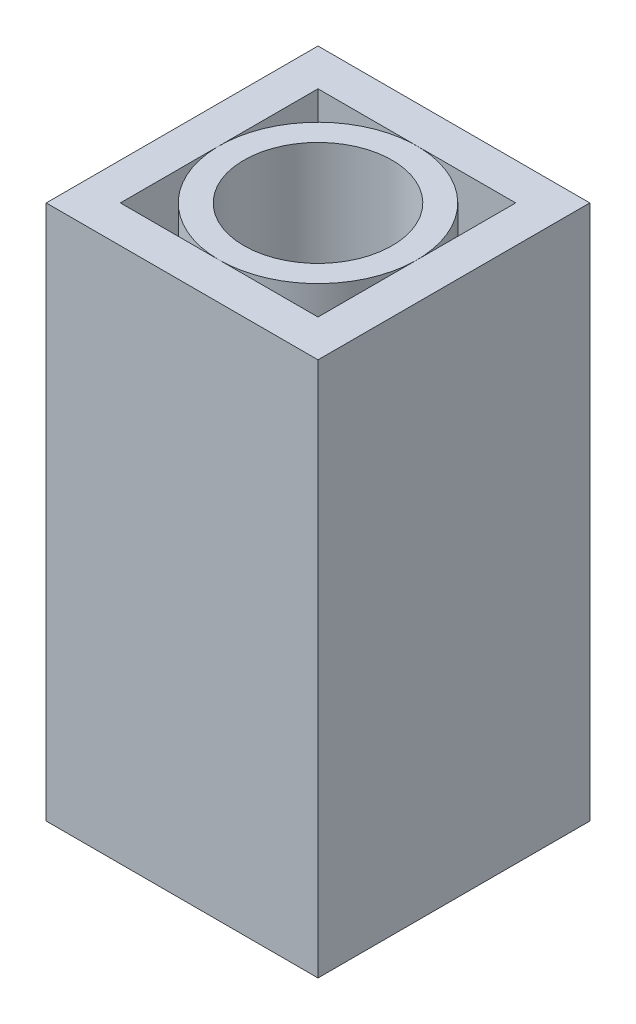
ISO-10303-21;
HEADER;
FILE_DESCRIPTION(('STEP AP214'),'2;1');
FILE_NAME('part.step','',(''),(''),'','','');
FILE_SCHEMA(('AUTOMOTIVE_DESIGN { 1 0 10303 214 1 1 1 1 }'));
ENDSEC;
DATA;
#1=APPLICATION_CONTEXT('core data for automotive mechanical design processes');
#2=APPLICATION_PROTOCOL_DEFINITION('international standard','automotive_design',2000,#1);
#3=PRODUCT_CONTEXT('',#1,'mechanical');
#4=PRODUCT('Part','Part','',(#3));
#5=PRODUCT_RELATED_PRODUCT_CATEGORY('part','',(#4));
#6=PRODUCT_DEFINITION_FORMATION('','',#4);
#7=PRODUCT_DEFINITION_CONTEXT('part definition',#1,'design');
#8=PRODUCT_DEFINITION('design','',#6,#7);
#9=PRODUCT_DEFINITION_SHAPE('','',#8);
#10=(LENGTH_UNIT() NAMED_UNIT(*) SI_UNIT(.MILLI.,.METRE.));
#11=(NAMED_UNIT(*) PLANE_ANGLE_UNIT() SI_UNIT($,.RADIAN.));
#12=(NAMED_UNIT(*) SI_UNIT($,.STERADIAN.) SOLID_ANGLE_UNIT());
#13=UNCERTAINTY_MEASURE_WITH_UNIT(LENGTH_MEASURE(1.E-05),#10,'distance_accuracy_value','');
#14=(GEOMETRIC_REPRESENTATION_CONTEXT(3) GLOBAL_UNCERTAINTY_ASSIGNED_CONTEXT((#13)) GLOBAL_UNIT_ASSIGNED_CONTEXT((#10,
#11,#12)) REPRESENTATION_CONTEXT('',''));
#15=CARTESIAN_POINT('',(0.,0.,0.));
#16=DIRECTION('',(0.,0.,1.));
#17=DIRECTION('',(1.,0.,0.));
#18=AXIS2_PLACEMENT_3D('',#15,#16,#17);
#19=CARTESIAN_POINT('',(0.,65.,0.));
#20=DIRECTION('',(0.,-1.,0.));
#21=DIRECTION('',(0.,0.,-1.));
#22=AXIS2_PLACEMENT_3D('',#19,#20,#21);
#23=CYLINDRICAL_SURFACE('',#22,9.);
#24=CARTESIAN_POINT('',(0.,30.,0.));
#25=DIRECTION('',(0.,1.,0.));
#26=DIRECTION('',(0.,0.,1.));
#27=AXIS2_PLACEMENT_3D('',#24,#25,#26);
#28=CIRCLE('',#27,9.);
#29=CARTESIAN_POINT('',(0.,30.,9.));
#30=VERTEX_POINT('',#29);
#31=EDGE_CURVE('E12',#30,#30,#28,.T.);
#32=ORIENTED_EDGE('',*,*,#31,.F.);
#33=EDGE_LOOP('',(#32));
#34=FACE_BOUND('',#33,.T.);
#35=CARTESIAN_POINT('',(0.,65.,0.));
#36=DIRECTION('',(0.,1.,0.));
#37=DIRECTION('',(0.,0.,1.));
#38=AXIS2_PLACEMENT_3D('',#35,#36,#37);
#39=CIRCLE('',#38,9.);
#40=CARTESIAN_POINT('',(0.,65.,9.));
#41=VERTEX_POINT('',#40);
#42=EDGE_CURVE('E70',#41,#41,#39,.T.);
#43=ORIENTED_EDGE('',*,*,#42,.T.);
#44=EDGE_LOOP('',(#43));
#45=FACE_BOUND('',#44,.T.);
#46=ADVANCED_FACE('F60',(#34,#45),#23,.F.);
#47=CARTESIAN_POINT('',(0.,65.,0.));
#48=DIRECTION('',(0.,-1.,0.));
#49=DIRECTION('',(0.,0.,-1.));
#50=AXIS2_PLACEMENT_3D('',#47,#48,#49);
#51=CYLINDRICAL_SURFACE('',#50,12.);
#52=CARTESIAN_POINT('',(0.,65.,0.));
#53=DIRECTION('',(0.,1.,0.));
#54=DIRECTION('',(0.,0.,1.));
#55=AXIS2_PLACEMENT_3D('',#52,#53,#54);
#56=CIRCLE('',#55,12.);
#57=CARTESIAN_POINT('',(0.,65.,12.));
#58=VERTEX_POINT('',#57);
#59=EDGE_CURVE('E66',#58,#58,#56,.T.);
#60=ORIENTED_EDGE('',*,*,#59,.F.);
#61=EDGE_LOOP('',(#60));
#62=FACE_BOUND('',#61,.T.);
#63=CARTESIAN_POINT('',(0.,0.,0.));
#64=DIRECTION('',(0.,1.,0.));
#65=DIRECTION('',(0.,0.,1.));
#66=AXIS2_PLACEMENT_3D('',#63,#64,#65);
#67=CIRCLE('',#66,12.);
#68=CARTESIAN_POINT('',(0.,0.,12.));
#69=VERTEX_POINT('',#68);
#70=EDGE_CURVE('E75',#69,#69,#67,.T.);
#71=ORIENTED_EDGE('',*,*,#70,.T.);
#72=EDGE_LOOP('',(#71));
#73=FACE_BOUND('',#72,.T.);
#74=ADVANCED_FACE('F80',(#62,#73),#51,.T.);
#75=CARTESIAN_POINT('',(0.,65.,0.));
#76=DIRECTION('',(0.,1.,0.));
#77=DIRECTION('',(0.,0.,1.));
#78=AXIS2_PLACEMENT_3D('',#75,#76,#77);
#79=PLANE('',#78);
#80=ORIENTED_EDGE('',*,*,#42,.F.);
#81=EDGE_LOOP('',(#80));
#82=FACE_BOUND('',#81,.T.);
#83=ORIENTED_EDGE('',*,*,#59,.T.);
#84=EDGE_LOOP('',(#83));
#85=FACE_BOUND('',#84,.T.);
#86=ADVANCED_FACE('F85',(#82,#85),#79,.T.);
#87=CARTESIAN_POINT('',(0.,0.,0.));
#88=DIRECTION('',(0.,1.,0.));
#89=DIRECTION('',(0.,0.,1.));
#90=AXIS2_PLACEMENT_3D('',#87,#88,#89);
#91=PLANE('',#90);
#92=ORIENTED_EDGE('',*,*,#70,.F.);
#93=EDGE_LOOP('',(#92));
#94=FACE_BOUND('',#93,.T.);
#95=ADVANCED_FACE('F82',(#94),#91,.F.);
#96=CARTESIAN_POINT('',(0.,30.,0.));
#97=DIRECTION('',(0.,1.,0.));
#98=DIRECTION('',(0.,0.,1.));
#99=AXIS2_PLACEMENT_3D('',#96,#97,#98);
#100=PLANE('',#99);
#101=ORIENTED_EDGE('',*,*,#31,.T.);
#102=EDGE_LOOP('',(#101));
#103=FACE_BOUND('',#102,.T.);
#104=ADVANCED_FACE('F84',(#103),#100,.T.);
#105=CLOSED_SHELL('',(#46,#74,#86,#95,#104));
#106=MANIFOLD_SOLID_BREP('B2',#105);
#107=CARTESIAN_POINT('',(0.,65.,16.5));
#108=DIRECTION('',(0.,0.,-1.));
#109=DIRECTION('',(-1.,0.,0.));
#110=AXIS2_PLACEMENT_3D('',#107,#108,#109);
#111=PLANE('',#110);
#112=DIRECTION('',(1.,0.,0.));
#113=VECTOR('',#112,1.);
#114=CARTESIAN_POINT('',(0.,0.,16.5));
#115=LINE('',#114,#113);
#116=CARTESIAN_POINT('',(-16.4999999998139,0.,16.5));
#117=VERTEX_POINT('',#116);
#118=CARTESIAN_POINT('',(16.4999999998139,0.,16.5));
#119=VERTEX_POINT('',#118);
#120=EDGE_CURVE('E242',#117,#119,#115,.T.);
#121=ORIENTED_EDGE('',*,*,#120,.T.);
#122=DIRECTION('',(0.,-1.,0.));
#123=VECTOR('',#122,1.);
#124=CARTESIAN_POINT('',(16.4999999998139,65.,16.5));
#125=LINE('',#124,#123);
#126=CARTESIAN_POINT('',(16.4999999998139,65.,16.5));
#127=VERTEX_POINT('',#126);
#128=EDGE_CURVE('E58',#127,#119,#125,.T.);
#129=ORIENTED_EDGE('',*,*,#128,.F.);
#130=DIRECTION('',(1.,0.,0.));
#131=VECTOR('',#130,1.);
#132=CARTESIAN_POINT('',(0.,65.,16.5));
#133=LINE('',#132,#131);
#134=CARTESIAN_POINT('',(-16.4999999998139,65.,16.5));
#135=VERTEX_POINT('',#134);
#136=EDGE_CURVE('E213',#135,#127,#133,.T.);
#137=ORIENTED_EDGE('',*,*,#136,.F.);
#138=DIRECTION('',(0.,-1.,0.));
#139=VECTOR('',#138,1.);
#140=CARTESIAN_POINT('',(-16.4999999998139,65.,16.5));
#141=LINE('',#140,#139);
#142=EDGE_CURVE('E153',#135,#117,#141,.T.);
#143=ORIENTED_EDGE('',*,*,#142,.T.);
#144=EDGE_LOOP('',(#121,#129,#137,#143));
#145=FACE_BOUND('',#144,.T.);
#146=ADVANCED_FACE('F134',(#145),#111,.F.);
#147=CARTESIAN_POINT('',(16.4999999998139,65.,0.));
#148=DIRECTION('',(-1.,0.,0.));
#149=DIRECTION('',(0.,0.,1.));
#150=AXIS2_PLACEMENT_3D('',#147,#148,#149);
#151=PLANE('',#150);
#152=DIRECTION('',(0.,0.,-1.));
#153=VECTOR('',#152,1.);
#154=CARTESIAN_POINT('',(16.4999999998139,0.,0.));
#155=LINE('',#154,#153);
#156=CARTESIAN_POINT('',(16.4999999998139,0.,-16.5));
#157=VERTEX_POINT('',#156);
#158=EDGE_CURVE('E219',#119,#157,#155,.T.);
#159=ORIENTED_EDGE('',*,*,#158,.T.);
#160=DIRECTION('',(0.,-1.,0.));
#161=VECTOR('',#160,1.);
#162=CARTESIAN_POINT('',(16.4999999998139,65.,-16.5));
#163=LINE('',#162,#161);
#164=CARTESIAN_POINT('',(16.4999999998139,65.,-16.5));
#165=VERTEX_POINT('',#164);
#166=EDGE_CURVE('E144',#165,#157,#163,.T.);
#167=ORIENTED_EDGE('',*,*,#166,.F.);
#168=DIRECTION('',(0.,0.,-1.));
#169=VECTOR('',#168,1.);
#170=CARTESIAN_POINT('',(16.4999999998139,65.,0.));
#171=LINE('',#170,#169);
#172=EDGE_CURVE('E207',#127,#165,#171,.T.);
#173=ORIENTED_EDGE('',*,*,#172,.F.);
#174=ORIENTED_EDGE('',*,*,#128,.T.);
#175=EDGE_LOOP('',(#159,#167,#173,#174));
#176=FACE_BOUND('',#175,.T.);
#177=ADVANCED_FACE('F218',(#176),#151,.F.);
#178=CARTESIAN_POINT('',(0.,65.,-16.5));
#179=DIRECTION('',(0.,0.,-1.));
#180=DIRECTION('',(-1.,0.,0.));
#181=AXIS2_PLACEMENT_3D('',#178,#179,#180);
#182=PLANE('',#181);
#183=DIRECTION('',(1.,0.,0.));
#184=VECTOR('',#183,1.);
#185=CARTESIAN_POINT('',(0.,0.,-16.5));
#186=LINE('',#185,#184);
#187=CARTESIAN_POINT('',(-16.4999999998139,0.,-16.5));
#188=VERTEX_POINT('',#187);
#189=EDGE_CURVE('E245',#188,#157,#186,.T.);
#190=ORIENTED_EDGE('',*,*,#189,.F.);
#191=DIRECTION('',(0.,-1.,0.));
#192=VECTOR('',#191,1.);
#193=CARTESIAN_POINT('',(-16.4999999998139,65.,-16.5));
#194=LINE('',#193,#192);
#195=CARTESIAN_POINT('',(-16.4999999998139,65.,-16.5));
#196=VERTEX_POINT('',#195);
#197=EDGE_CURVE('E179',#196,#188,#194,.T.);
#198=ORIENTED_EDGE('',*,*,#197,.F.);
#199=DIRECTION('',(1.,0.,0.));
#200=VECTOR('',#199,1.);
#201=CARTESIAN_POINT('',(0.,65.,-16.5));
#202=LINE('',#201,#200);
#203=EDGE_CURVE('E212',#196,#165,#202,.T.);
#204=ORIENTED_EDGE('',*,*,#203,.T.);
#205=ORIENTED_EDGE('',*,*,#166,.T.);
#206=EDGE_LOOP('',(#190,#198,#204,#205));
#207=FACE_BOUND('',#206,.T.);
#208=ADVANCED_FACE('F223',(#207),#182,.T.);
#209=CARTESIAN_POINT('',(0.,65.,-12.));
#210=DIRECTION('',(0.,0.,1.));
#211=DIRECTION('',(1.,0.,0.));
#212=AXIS2_PLACEMENT_3D('',#209,#210,#211);
#213=PLANE('',#212);
#214=DIRECTION('',(-1.,0.,0.));
#215=VECTOR('',#214,1.);
#216=CARTESIAN_POINT('',(0.,0.,-12.));
#217=LINE('',#216,#215);
#218=CARTESIAN_POINT('',(12.,0.,-12.));
#219=VERTEX_POINT('',#218);
#220=CARTESIAN_POINT('',(-12.,0.,-12.));
#221=VERTEX_POINT('',#220);
#222=EDGE_CURVE('E230',#219,#221,#217,.T.);
#223=ORIENTED_EDGE('',*,*,#222,.F.);
#224=DIRECTION('',(0.,-1.,0.));
#225=VECTOR('',#224,1.);
#226=CARTESIAN_POINT('',(12.,65.,-12.));
#227=LINE('',#226,#225);
#228=CARTESIAN_POINT('',(12.,65.,-12.));
#229=VERTEX_POINT('',#228);
#230=EDGE_CURVE('E138',#229,#219,#227,.T.);
#231=ORIENTED_EDGE('',*,*,#230,.F.);
#232=DIRECTION('',(-1.,0.,0.));
#233=VECTOR('',#232,1.);
#234=CARTESIAN_POINT('',(0.,65.,-12.));
#235=LINE('',#234,#233);
#236=CARTESIAN_POINT('',(-12.,65.,-12.));
#237=VERTEX_POINT('',#236);
#238=EDGE_CURVE('E250',#229,#237,#235,.T.);
#239=ORIENTED_EDGE('',*,*,#238,.T.);
#240=DIRECTION('',(0.,-1.,0.));
#241=VECTOR('',#240,1.);
#242=CARTESIAN_POINT('',(-12.,65.,-12.));
#243=LINE('',#242,#241);
#244=EDGE_CURVE('E226',#237,#221,#243,.T.);
#245=ORIENTED_EDGE('',*,*,#244,.T.);
#246=EDGE_LOOP('',(#223,#231,#239,#245));
#247=FACE_BOUND('',#246,.T.);
#248=ADVANCED_FACE('F136',(#247),#213,.T.);
#249=CARTESIAN_POINT('',(12.,65.,0.));
#250=DIRECTION('',(-1.,0.,0.));
#251=DIRECTION('',(0.,0.,1.));
#252=AXIS2_PLACEMENT_3D('',#249,#250,#251);
#253=PLANE('',#252);
#254=DIRECTION('',(0.,0.,-1.));
#255=VECTOR('',#254,1.);
#256=CARTESIAN_POINT('',(12.,0.,0.));
#257=LINE('',#256,#255);
#258=CARTESIAN_POINT('',(12.,0.,12.));
#259=VERTEX_POINT('',#258);
#260=EDGE_CURVE('E233',#259,#219,#257,.T.);
#261=ORIENTED_EDGE('',*,*,#260,.F.);
#262=DIRECTION('',(0.,-1.,0.));
#263=VECTOR('',#262,1.);
#264=CARTESIAN_POINT('',(12.,65.,12.));
#265=LINE('',#264,#263);
#266=CARTESIAN_POINT('',(12.,65.,12.));
#267=VERTEX_POINT('',#266);
#268=EDGE_CURVE('E255',#267,#259,#265,.T.);
#269=ORIENTED_EDGE('',*,*,#268,.F.);
#270=DIRECTION('',(0.,0.,-1.));
#271=VECTOR('',#270,1.);
#272=CARTESIAN_POINT('',(12.,65.,0.));
#273=LINE('',#272,#271);
#274=EDGE_CURVE('E264',#267,#229,#273,.T.);
#275=ORIENTED_EDGE('',*,*,#274,.T.);
#276=ORIENTED_EDGE('',*,*,#230,.T.);
#277=EDGE_LOOP('',(#261,#269,#275,#276));
#278=FACE_BOUND('',#277,.T.);
#279=ADVANCED_FACE('F262',(#278),#253,.T.);
#280=CARTESIAN_POINT('',(0.,65.,12.));
#281=DIRECTION('',(0.,0.,-1.));
#282=DIRECTION('',(-1.,0.,0.));
#283=AXIS2_PLACEMENT_3D('',#280,#281,#282);
#284=PLANE('',#283);
#285=DIRECTION('',(1.,0.,0.));
#286=VECTOR('',#285,1.);
#287=CARTESIAN_POINT('',(0.,0.,12.));
#288=LINE('',#287,#286);
#289=CARTESIAN_POINT('',(-12.,0.,12.));
#290=VERTEX_POINT('',#289);
#291=EDGE_CURVE('E236',#290,#259,#288,.T.);
#292=ORIENTED_EDGE('',*,*,#291,.F.);
#293=DIRECTION('',(0.,-1.,0.));
#294=VECTOR('',#293,1.);
#295=CARTESIAN_POINT('',(-12.,65.,12.));
#296=LINE('',#295,#294);
#297=CARTESIAN_POINT('',(-12.,65.,12.));
#298=VERTEX_POINT('',#297);
#299=EDGE_CURVE('E254',#298,#290,#296,.T.);
#300=ORIENTED_EDGE('',*,*,#299,.F.);
#301=DIRECTION('',(1.,0.,0.));
#302=VECTOR('',#301,1.);
#303=CARTESIAN_POINT('',(0.,65.,12.));
#304=LINE('',#303,#302);
#305=EDGE_CURVE('E271',#298,#267,#304,.T.);
#306=ORIENTED_EDGE('',*,*,#305,.T.);
#307=ORIENTED_EDGE('',*,*,#268,.T.);
#308=EDGE_LOOP('',(#292,#300,#306,#307));
#309=FACE_BOUND('',#308,.T.);
#310=ADVANCED_FACE('F269',(#309),#284,.T.);
#311=CARTESIAN_POINT('',(-12.,65.,0.));
#312=DIRECTION('',(1.,0.,0.));
#313=DIRECTION('',(0.,0.,-1.));
#314=AXIS2_PLACEMENT_3D('',#311,#312,#313);
#315=PLANE('',#314);
#316=DIRECTION('',(0.,0.,1.));
#317=VECTOR('',#316,1.);
#318=CARTESIAN_POINT('',(-12.,0.,0.));
#319=LINE('',#318,#317);
#320=EDGE_CURVE('E239',#221,#290,#319,.T.);
#321=ORIENTED_EDGE('',*,*,#320,.F.);
#322=ORIENTED_EDGE('',*,*,#244,.F.);
#323=DIRECTION('',(0.,0.,1.));
#324=VECTOR('',#323,1.);
#325=CARTESIAN_POINT('',(-12.,65.,0.));
#326=LINE('',#325,#324);
#327=EDGE_CURVE('E276',#237,#298,#326,.T.);
#328=ORIENTED_EDGE('',*,*,#327,.T.);
#329=ORIENTED_EDGE('',*,*,#299,.T.);
#330=EDGE_LOOP('',(#321,#322,#328,#329));
#331=FACE_BOUND('',#330,.T.);
#332=ADVANCED_FACE('F278',(#331),#315,.T.);
#333=CARTESIAN_POINT('',(-16.4999999998139,65.,0.));
#334=DIRECTION('',(-1.,0.,0.));
#335=DIRECTION('',(0.,0.,1.));
#336=AXIS2_PLACEMENT_3D('',#333,#334,#335);
#337=PLANE('',#336);
#338=DIRECTION('',(0.,0.,-1.));
#339=VECTOR('',#338,1.);
#340=CARTESIAN_POINT('',(-16.4999999998139,0.,0.));
#341=LINE('',#340,#339);
#342=EDGE_CURVE('E247',#117,#188,#341,.T.);
#343=ORIENTED_EDGE('',*,*,#342,.F.);
#344=ORIENTED_EDGE('',*,*,#142,.F.);
#345=DIRECTION('',(0.,0.,-1.));
#346=VECTOR('',#345,1.);
#347=CARTESIAN_POINT('',(-16.4999999998139,65.,0.));
#348=LINE('',#347,#346);
#349=EDGE_CURVE('E224',#135,#196,#348,.T.);
#350=ORIENTED_EDGE('',*,*,#349,.T.);
#351=ORIENTED_EDGE('',*,*,#197,.T.);
#352=EDGE_LOOP('',(#343,#344,#350,#351));
#353=FACE_BOUND('',#352,.T.);
#354=ADVANCED_FACE('F283',(#353),#337,.T.);
#355=CARTESIAN_POINT('',(0.,65.,0.));
#356=DIRECTION('',(0.,1.,0.));
#357=DIRECTION('',(0.,0.,1.));
#358=AXIS2_PLACEMENT_3D('',#355,#356,#357);
#359=PLANE('',#358);
#360=ORIENTED_EDGE('',*,*,#238,.F.);
#361=ORIENTED_EDGE('',*,*,#274,.F.);
#362=ORIENTED_EDGE('',*,*,#305,.F.);
#363=ORIENTED_EDGE('',*,*,#327,.F.);
#364=EDGE_LOOP('',(#360,#361,#362,#363));
#365=FACE_BOUND('',#364,.T.);
#366=ORIENTED_EDGE('',*,*,#136,.T.);
#367=ORIENTED_EDGE('',*,*,#172,.T.);
#368=ORIENTED_EDGE('',*,*,#203,.F.);
#369=ORIENTED_EDGE('',*,*,#349,.F.);
#370=EDGE_LOOP('',(#366,#367,#368,#369));
#371=FACE_BOUND('',#370,.T.);
#372=ADVANCED_FACE('F209',(#365,#371),#359,.T.);
#373=CARTESIAN_POINT('',(0.,0.,0.));
#374=DIRECTION('',(0.,1.,0.));
#375=DIRECTION('',(0.,0.,1.));
#376=AXIS2_PLACEMENT_3D('',#373,#374,#375);
#377=PLANE('',#376);
#378=ORIENTED_EDGE('',*,*,#222,.T.);
#379=ORIENTED_EDGE('',*,*,#320,.T.);
#380=ORIENTED_EDGE('',*,*,#291,.T.);
#381=ORIENTED_EDGE('',*,*,#260,.T.);
#382=EDGE_LOOP('',(#378,#379,#380,#381));
#383=FACE_BOUND('',#382,.T.);
#384=ORIENTED_EDGE('',*,*,#120,.F.);
#385=ORIENTED_EDGE('',*,*,#342,.T.);
#386=ORIENTED_EDGE('',*,*,#189,.T.);
#387=ORIENTED_EDGE('',*,*,#158,.F.);
#388=EDGE_LOOP('',(#384,#385,#386,#387));
#389=FACE_BOUND('',#388,.T.);
#390=ADVANCED_FACE('F267',(#383,#389),#377,.F.);
#391=CLOSED_SHELL('',(#146,#177,#208,#248,#279,#310,#332,#354,#372,#390));
#392=MANIFOLD_SOLID_BREP('B7',#391);
#393=ADVANCED_BREP_SHAPE_REPRESENTATION('',(#18,#106,#392),#14);
#394=SHAPE_DEFINITION_REPRESENTATION(#9,#393);
ENDSEC;
END-ISO-10303-21;
